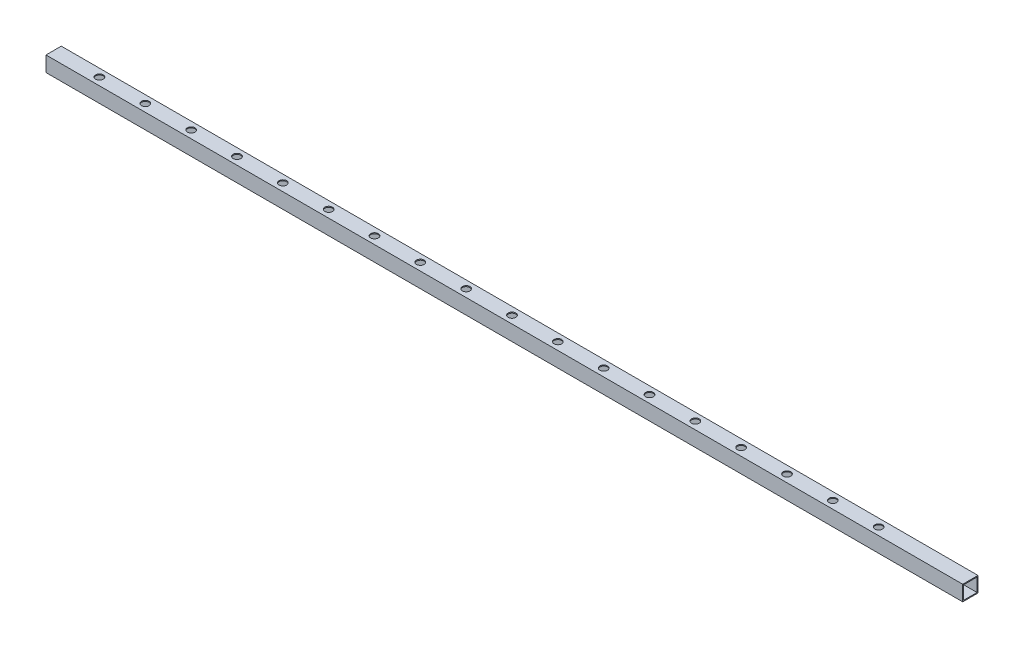
ISO-10303-21;
HEADER;
FILE_DESCRIPTION(('STEP AP214'),'2;1');
FILE_NAME('part.step','',(''),(''),'','','');
FILE_SCHEMA(('AUTOMOTIVE_DESIGN { 1 0 10303 214 1 1 1 1 }'));
ENDSEC;
DATA;
#1=APPLICATION_CONTEXT('core data for automotive mechanical design processes');
#2=APPLICATION_PROTOCOL_DEFINITION('international standard','automotive_design',2000,#1);
#3=PRODUCT_CONTEXT('',#1,'mechanical');
#4=PRODUCT('Part','Part','',(#3));
#5=PRODUCT_RELATED_PRODUCT_CATEGORY('part','',(#4));
#6=PRODUCT_DEFINITION_FORMATION('','',#4);
#7=PRODUCT_DEFINITION_CONTEXT('part definition',#1,'design');
#8=PRODUCT_DEFINITION('design','',#6,#7);
#9=PRODUCT_DEFINITION_SHAPE('','',#8);
#10=(LENGTH_UNIT() NAMED_UNIT(*) SI_UNIT(.MILLI.,.METRE.));
#11=(NAMED_UNIT(*) PLANE_ANGLE_UNIT() SI_UNIT($,.RADIAN.));
#12=(NAMED_UNIT(*) SI_UNIT($,.STERADIAN.) SOLID_ANGLE_UNIT());
#13=UNCERTAINTY_MEASURE_WITH_UNIT(LENGTH_MEASURE(1.E-05),#10,'distance_accuracy_value','');
#14=(GEOMETRIC_REPRESENTATION_CONTEXT(3) GLOBAL_UNCERTAINTY_ASSIGNED_CONTEXT((#13)) GLOBAL_UNIT_ASSIGNED_CONTEXT((#10,
#11,#12)) REPRESENTATION_CONTEXT('',''));
#15=CARTESIAN_POINT('',(0.,0.,0.));
#16=DIRECTION('',(0.,0.,1.));
#17=DIRECTION('',(1.,0.,0.));
#18=AXIS2_PLACEMENT_3D('',#15,#16,#17);
#19=CARTESIAN_POINT('',(76.2,12.7,0.));
#20=DIRECTION('',(0.,1.,0.));
#21=DIRECTION('',(0.,0.,1.));
#22=AXIS2_PLACEMENT_3D('',#19,#20,#21);
#23=CYLINDRICAL_SURFACE('',#22,6.35000000000008);
#24=CARTESIAN_POINT('',(76.2,12.7,0.));
#25=DIRECTION('',(0.,1.,0.));
#26=DIRECTION('',(0.,0.,1.));
#27=AXIS2_PLACEMENT_3D('',#24,#25,#26);
#28=CIRCLE('',#27,6.35000000000008);
#29=CARTESIAN_POINT('',(76.2,12.7,6.35000000000008));
#30=VERTEX_POINT('',#29);
#31=EDGE_CURVE('E46',#30,#30,#28,.T.);
#32=ORIENTED_EDGE('',*,*,#31,.T.);
#33=EDGE_LOOP('',(#32));
#34=FACE_BOUND('',#33,.T.);
#35=CARTESIAN_POINT('',(76.2,11.1125,0.));
#36=DIRECTION('',(0.,-1.,0.));
#37=DIRECTION('',(0.,0.,-1.));
#38=AXIS2_PLACEMENT_3D('',#35,#36,#37);
#39=CIRCLE('',#38,6.35000000000008);
#40=CARTESIAN_POINT('',(76.2,11.1125,-6.35000000000008));
#41=VERTEX_POINT('',#40);
#42=EDGE_CURVE('E11',#41,#41,#39,.T.);
#43=ORIENTED_EDGE('',*,*,#42,.T.);
#44=EDGE_LOOP('',(#43));
#45=FACE_BOUND('',#44,.T.);
#46=ADVANCED_FACE('F38',(#34,#45),#23,.F.);
#47=CARTESIAN_POINT('',(152.4,12.7,0.));
#48=DIRECTION('',(0.,1.,0.));
#49=DIRECTION('',(0.,0.,1.));
#50=AXIS2_PLACEMENT_3D('',#47,#48,#49);
#51=CYLINDRICAL_SURFACE('',#50,6.35000000000008);
#52=CARTESIAN_POINT('',(152.4,12.7,0.));
#53=DIRECTION('',(0.,1.,0.));
#54=DIRECTION('',(0.,0.,1.));
#55=AXIS2_PLACEMENT_3D('',#52,#53,#54);
#56=CIRCLE('',#55,6.35000000000008);
#57=CARTESIAN_POINT('',(152.4,12.7,6.35000000000008));
#58=VERTEX_POINT('',#57);
#59=EDGE_CURVE('E307',#58,#58,#56,.T.);
#60=ORIENTED_EDGE('',*,*,#59,.T.);
#61=EDGE_LOOP('',(#60));
#62=FACE_BOUND('',#61,.T.);
#63=CARTESIAN_POINT('',(152.4,11.1125,0.));
#64=DIRECTION('',(0.,-1.,0.));
#65=DIRECTION('',(0.,0.,-1.));
#66=AXIS2_PLACEMENT_3D('',#63,#64,#65);
#67=CIRCLE('',#66,6.35000000000008);
#68=CARTESIAN_POINT('',(152.4,11.1125,-6.35000000000008));
#69=VERTEX_POINT('',#68);
#70=EDGE_CURVE('E311',#69,#69,#67,.T.);
#71=ORIENTED_EDGE('',*,*,#70,.T.);
#72=EDGE_LOOP('',(#71));
#73=FACE_BOUND('',#72,.T.);
#74=ADVANCED_FACE('F342',(#62,#73),#51,.F.);
#75=CARTESIAN_POINT('',(228.6,12.7,0.));
#76=DIRECTION('',(0.,1.,0.));
#77=DIRECTION('',(0.,0.,1.));
#78=AXIS2_PLACEMENT_3D('',#75,#76,#77);
#79=CYLINDRICAL_SURFACE('',#78,6.35000000000008);
#80=CARTESIAN_POINT('',(228.6,12.7,0.));
#81=DIRECTION('',(0.,1.,0.));
#82=DIRECTION('',(0.,0.,1.));
#83=AXIS2_PLACEMENT_3D('',#80,#81,#82);
#84=CIRCLE('',#83,6.35000000000008);
#85=CARTESIAN_POINT('',(228.6,12.7,6.35000000000008));
#86=VERTEX_POINT('',#85);
#87=EDGE_CURVE('E299',#86,#86,#84,.T.);
#88=ORIENTED_EDGE('',*,*,#87,.T.);
#89=EDGE_LOOP('',(#88));
#90=FACE_BOUND('',#89,.T.);
#91=CARTESIAN_POINT('',(228.6,11.1125,0.));
#92=DIRECTION('',(0.,-1.,0.));
#93=DIRECTION('',(0.,0.,-1.));
#94=AXIS2_PLACEMENT_3D('',#91,#92,#93);
#95=CIRCLE('',#94,6.35000000000008);
#96=CARTESIAN_POINT('',(228.6,11.1125,-6.35000000000008));
#97=VERTEX_POINT('',#96);
#98=EDGE_CURVE('E303',#97,#97,#95,.T.);
#99=ORIENTED_EDGE('',*,*,#98,.T.);
#100=EDGE_LOOP('',(#99));
#101=FACE_BOUND('',#100,.T.);
#102=ADVANCED_FACE('F347',(#90,#101),#79,.F.);
#103=CARTESIAN_POINT('',(304.8,12.7,0.));
#104=DIRECTION('',(0.,1.,0.));
#105=DIRECTION('',(0.,0.,1.));
#106=AXIS2_PLACEMENT_3D('',#103,#104,#105);
#107=CYLINDRICAL_SURFACE('',#106,6.35000000000008);
#108=CARTESIAN_POINT('',(304.8,12.7,0.));
#109=DIRECTION('',(0.,1.,0.));
#110=DIRECTION('',(0.,0.,1.));
#111=AXIS2_PLACEMENT_3D('',#108,#109,#110);
#112=CIRCLE('',#111,6.35000000000008);
#113=CARTESIAN_POINT('',(304.8,12.7,6.35000000000008));
#114=VERTEX_POINT('',#113);
#115=EDGE_CURVE('E291',#114,#114,#112,.T.);
#116=ORIENTED_EDGE('',*,*,#115,.T.);
#117=EDGE_LOOP('',(#116));
#118=FACE_BOUND('',#117,.T.);
#119=CARTESIAN_POINT('',(304.8,11.1125,0.));
#120=DIRECTION('',(0.,-1.,0.));
#121=DIRECTION('',(0.,0.,-1.));
#122=AXIS2_PLACEMENT_3D('',#119,#120,#121);
#123=CIRCLE('',#122,6.35000000000008);
#124=CARTESIAN_POINT('',(304.8,11.1125,-6.35000000000008));
#125=VERTEX_POINT('',#124);
#126=EDGE_CURVE('E295',#125,#125,#123,.T.);
#127=ORIENTED_EDGE('',*,*,#126,.T.);
#128=EDGE_LOOP('',(#127));
#129=FACE_BOUND('',#128,.T.);
#130=ADVANCED_FACE('F352',(#118,#129),#107,.F.);
#131=CARTESIAN_POINT('',(381.,12.7,0.));
#132=DIRECTION('',(0.,1.,0.));
#133=DIRECTION('',(0.,0.,1.));
#134=AXIS2_PLACEMENT_3D('',#131,#132,#133);
#135=CYLINDRICAL_SURFACE('',#134,6.35000000000008);
#136=CARTESIAN_POINT('',(381.,12.7,0.));
#137=DIRECTION('',(0.,1.,0.));
#138=DIRECTION('',(0.,0.,1.));
#139=AXIS2_PLACEMENT_3D('',#136,#137,#138);
#140=CIRCLE('',#139,6.35000000000008);
#141=CARTESIAN_POINT('',(381.,12.7,6.35000000000008));
#142=VERTEX_POINT('',#141);
#143=EDGE_CURVE('E283',#142,#142,#140,.T.);
#144=ORIENTED_EDGE('',*,*,#143,.T.);
#145=EDGE_LOOP('',(#144));
#146=FACE_BOUND('',#145,.T.);
#147=CARTESIAN_POINT('',(381.,11.1125,0.));
#148=DIRECTION('',(0.,-1.,0.));
#149=DIRECTION('',(0.,0.,-1.));
#150=AXIS2_PLACEMENT_3D('',#147,#148,#149);
#151=CIRCLE('',#150,6.35000000000008);
#152=CARTESIAN_POINT('',(381.,11.1125,-6.35000000000008));
#153=VERTEX_POINT('',#152);
#154=EDGE_CURVE('E287',#153,#153,#151,.T.);
#155=ORIENTED_EDGE('',*,*,#154,.T.);
#156=EDGE_LOOP('',(#155));
#157=FACE_BOUND('',#156,.T.);
#158=ADVANCED_FACE('F359',(#146,#157),#135,.F.);
#159=CARTESIAN_POINT('',(457.2,12.7,0.));
#160=DIRECTION('',(0.,1.,0.));
#161=DIRECTION('',(0.,0.,1.));
#162=AXIS2_PLACEMENT_3D('',#159,#160,#161);
#163=CYLINDRICAL_SURFACE('',#162,6.35000000000008);
#164=CARTESIAN_POINT('',(457.2,12.7,0.));
#165=DIRECTION('',(0.,1.,0.));
#166=DIRECTION('',(0.,0.,1.));
#167=AXIS2_PLACEMENT_3D('',#164,#165,#166);
#168=CIRCLE('',#167,6.35000000000008);
#169=CARTESIAN_POINT('',(457.2,12.7,6.35000000000008));
#170=VERTEX_POINT('',#169);
#171=EDGE_CURVE('E275',#170,#170,#168,.T.);
#172=ORIENTED_EDGE('',*,*,#171,.T.);
#173=EDGE_LOOP('',(#172));
#174=FACE_BOUND('',#173,.T.);
#175=CARTESIAN_POINT('',(457.2,11.1125,0.));
#176=DIRECTION('',(0.,-1.,0.));
#177=DIRECTION('',(0.,0.,-1.));
#178=AXIS2_PLACEMENT_3D('',#175,#176,#177);
#179=CIRCLE('',#178,6.35000000000008);
#180=CARTESIAN_POINT('',(457.2,11.1125,-6.35000000000008));
#181=VERTEX_POINT('',#180);
#182=EDGE_CURVE('E279',#181,#181,#179,.T.);
#183=ORIENTED_EDGE('',*,*,#182,.T.);
#184=EDGE_LOOP('',(#183));
#185=FACE_BOUND('',#184,.T.);
#186=ADVANCED_FACE('F363',(#174,#185),#163,.F.);
#187=CARTESIAN_POINT('',(533.4,12.7,0.));
#188=DIRECTION('',(0.,1.,0.));
#189=DIRECTION('',(0.,0.,1.));
#190=AXIS2_PLACEMENT_3D('',#187,#188,#189);
#191=CYLINDRICAL_SURFACE('',#190,6.35000000000008);
#192=CARTESIAN_POINT('',(533.4,12.7,0.));
#193=DIRECTION('',(0.,1.,0.));
#194=DIRECTION('',(0.,0.,1.));
#195=AXIS2_PLACEMENT_3D('',#192,#193,#194);
#196=CIRCLE('',#195,6.35000000000008);
#197=CARTESIAN_POINT('',(533.4,12.7,6.35000000000008));
#198=VERTEX_POINT('',#197);
#199=EDGE_CURVE('E267',#198,#198,#196,.T.);
#200=ORIENTED_EDGE('',*,*,#199,.T.);
#201=EDGE_LOOP('',(#200));
#202=FACE_BOUND('',#201,.T.);
#203=CARTESIAN_POINT('',(533.4,11.1125,0.));
#204=DIRECTION('',(0.,-1.,0.));
#205=DIRECTION('',(0.,0.,-1.));
#206=AXIS2_PLACEMENT_3D('',#203,#204,#205);
#207=CIRCLE('',#206,6.35000000000008);
#208=CARTESIAN_POINT('',(533.4,11.1125,-6.35000000000008));
#209=VERTEX_POINT('',#208);
#210=EDGE_CURVE('E271',#209,#209,#207,.T.);
#211=ORIENTED_EDGE('',*,*,#210,.T.);
#212=EDGE_LOOP('',(#211));
#213=FACE_BOUND('',#212,.T.);
#214=ADVANCED_FACE('F367',(#202,#213),#191,.F.);
#215=CARTESIAN_POINT('',(609.6,12.7,0.));
#216=DIRECTION('',(0.,1.,0.));
#217=DIRECTION('',(0.,0.,1.));
#218=AXIS2_PLACEMENT_3D('',#215,#216,#217);
#219=CYLINDRICAL_SURFACE('',#218,6.35000000000008);
#220=CARTESIAN_POINT('',(609.6,12.7,0.));
#221=DIRECTION('',(0.,1.,0.));
#222=DIRECTION('',(0.,0.,1.));
#223=AXIS2_PLACEMENT_3D('',#220,#221,#222);
#224=CIRCLE('',#223,6.35000000000008);
#225=CARTESIAN_POINT('',(609.6,12.7,6.35000000000008));
#226=VERTEX_POINT('',#225);
#227=EDGE_CURVE('E259',#226,#226,#224,.T.);
#228=ORIENTED_EDGE('',*,*,#227,.T.);
#229=EDGE_LOOP('',(#228));
#230=FACE_BOUND('',#229,.T.);
#231=CARTESIAN_POINT('',(609.6,11.1125,0.));
#232=DIRECTION('',(0.,-1.,0.));
#233=DIRECTION('',(0.,0.,-1.));
#234=AXIS2_PLACEMENT_3D('',#231,#232,#233);
#235=CIRCLE('',#234,6.35000000000008);
#236=CARTESIAN_POINT('',(609.6,11.1125,-6.35000000000008));
#237=VERTEX_POINT('',#236);
#238=EDGE_CURVE('E263',#237,#237,#235,.T.);
#239=ORIENTED_EDGE('',*,*,#238,.T.);
#240=EDGE_LOOP('',(#239));
#241=FACE_BOUND('',#240,.T.);
#242=ADVANCED_FACE('F371',(#230,#241),#219,.F.);
#243=CARTESIAN_POINT('',(685.8,12.7,0.));
#244=DIRECTION('',(0.,1.,0.));
#245=DIRECTION('',(0.,0.,1.));
#246=AXIS2_PLACEMENT_3D('',#243,#244,#245);
#247=CYLINDRICAL_SURFACE('',#246,6.35000000000008);
#248=CARTESIAN_POINT('',(685.8,12.7,0.));
#249=DIRECTION('',(0.,1.,0.));
#250=DIRECTION('',(0.,0.,1.));
#251=AXIS2_PLACEMENT_3D('',#248,#249,#250);
#252=CIRCLE('',#251,6.35000000000008);
#253=CARTESIAN_POINT('',(685.8,12.7,6.35000000000008));
#254=VERTEX_POINT('',#253);
#255=EDGE_CURVE('E251',#254,#254,#252,.T.);
#256=ORIENTED_EDGE('',*,*,#255,.T.);
#257=EDGE_LOOP('',(#256));
#258=FACE_BOUND('',#257,.T.);
#259=CARTESIAN_POINT('',(685.8,11.1125,0.));
#260=DIRECTION('',(0.,-1.,0.));
#261=DIRECTION('',(0.,0.,-1.));
#262=AXIS2_PLACEMENT_3D('',#259,#260,#261);
#263=CIRCLE('',#262,6.35000000000008);
#264=CARTESIAN_POINT('',(685.8,11.1125,-6.35000000000008));
#265=VERTEX_POINT('',#264);
#266=EDGE_CURVE('E255',#265,#265,#263,.T.);
#267=ORIENTED_EDGE('',*,*,#266,.T.);
#268=EDGE_LOOP('',(#267));
#269=FACE_BOUND('',#268,.T.);
#270=ADVANCED_FACE('F375',(#258,#269),#247,.F.);
#271=CARTESIAN_POINT('',(762.,12.7,0.));
#272=DIRECTION('',(0.,1.,0.));
#273=DIRECTION('',(0.,0.,1.));
#274=AXIS2_PLACEMENT_3D('',#271,#272,#273);
#275=CYLINDRICAL_SURFACE('',#274,6.35000000000008);
#276=CARTESIAN_POINT('',(762.,12.7,0.));
#277=DIRECTION('',(0.,1.,0.));
#278=DIRECTION('',(0.,0.,1.));
#279=AXIS2_PLACEMENT_3D('',#276,#277,#278);
#280=CIRCLE('',#279,6.35000000000008);
#281=CARTESIAN_POINT('',(762.,12.7,6.35000000000008));
#282=VERTEX_POINT('',#281);
#283=EDGE_CURVE('E243',#282,#282,#280,.T.);
#284=ORIENTED_EDGE('',*,*,#283,.T.);
#285=EDGE_LOOP('',(#284));
#286=FACE_BOUND('',#285,.T.);
#287=CARTESIAN_POINT('',(762.,11.1125,0.));
#288=DIRECTION('',(0.,-1.,0.));
#289=DIRECTION('',(0.,0.,-1.));
#290=AXIS2_PLACEMENT_3D('',#287,#288,#289);
#291=CIRCLE('',#290,6.35000000000008);
#292=CARTESIAN_POINT('',(762.,11.1125,-6.35000000000008));
#293=VERTEX_POINT('',#292);
#294=EDGE_CURVE('E247',#293,#293,#291,.T.);
#295=ORIENTED_EDGE('',*,*,#294,.T.);
#296=EDGE_LOOP('',(#295));
#297=FACE_BOUND('',#296,.T.);
#298=ADVANCED_FACE('F379',(#286,#297),#275,.F.);
#299=CARTESIAN_POINT('',(838.2,12.7,0.));
#300=DIRECTION('',(0.,1.,0.));
#301=DIRECTION('',(0.,0.,1.));
#302=AXIS2_PLACEMENT_3D('',#299,#300,#301);
#303=CYLINDRICAL_SURFACE('',#302,6.35000000000008);
#304=CARTESIAN_POINT('',(838.2,12.7,0.));
#305=DIRECTION('',(0.,1.,0.));
#306=DIRECTION('',(0.,0.,1.));
#307=AXIS2_PLACEMENT_3D('',#304,#305,#306);
#308=CIRCLE('',#307,6.35000000000008);
#309=CARTESIAN_POINT('',(838.2,12.7,6.35000000000008));
#310=VERTEX_POINT('',#309);
#311=EDGE_CURVE('E235',#310,#310,#308,.T.);
#312=ORIENTED_EDGE('',*,*,#311,.T.);
#313=EDGE_LOOP('',(#312));
#314=FACE_BOUND('',#313,.T.);
#315=CARTESIAN_POINT('',(838.2,11.1125,0.));
#316=DIRECTION('',(0.,-1.,0.));
#317=DIRECTION('',(0.,0.,-1.));
#318=AXIS2_PLACEMENT_3D('',#315,#316,#317);
#319=CIRCLE('',#318,6.35000000000008);
#320=CARTESIAN_POINT('',(838.2,11.1125,-6.35000000000008));
#321=VERTEX_POINT('',#320);
#322=EDGE_CURVE('E239',#321,#321,#319,.T.);
#323=ORIENTED_EDGE('',*,*,#322,.T.);
#324=EDGE_LOOP('',(#323));
#325=FACE_BOUND('',#324,.T.);
#326=ADVANCED_FACE('F383',(#314,#325),#303,.F.);
#327=CARTESIAN_POINT('',(914.4,12.7,0.));
#328=DIRECTION('',(0.,1.,0.));
#329=DIRECTION('',(0.,0.,1.));
#330=AXIS2_PLACEMENT_3D('',#327,#328,#329);
#331=CYLINDRICAL_SURFACE('',#330,6.35000000000008);
#332=CARTESIAN_POINT('',(914.4,12.7,0.));
#333=DIRECTION('',(0.,1.,0.));
#334=DIRECTION('',(0.,0.,1.));
#335=AXIS2_PLACEMENT_3D('',#332,#333,#334);
#336=CIRCLE('',#335,6.35000000000008);
#337=CARTESIAN_POINT('',(914.4,12.7,6.35000000000008));
#338=VERTEX_POINT('',#337);
#339=EDGE_CURVE('E227',#338,#338,#336,.T.);
#340=ORIENTED_EDGE('',*,*,#339,.T.);
#341=EDGE_LOOP('',(#340));
#342=FACE_BOUND('',#341,.T.);
#343=CARTESIAN_POINT('',(914.4,11.1125,0.));
#344=DIRECTION('',(0.,-1.,0.));
#345=DIRECTION('',(0.,0.,-1.));
#346=AXIS2_PLACEMENT_3D('',#343,#344,#345);
#347=CIRCLE('',#346,6.35000000000008);
#348=CARTESIAN_POINT('',(914.4,11.1125,-6.35000000000008));
#349=VERTEX_POINT('',#348);
#350=EDGE_CURVE('E231',#349,#349,#347,.T.);
#351=ORIENTED_EDGE('',*,*,#350,.T.);
#352=EDGE_LOOP('',(#351));
#353=FACE_BOUND('',#352,.T.);
#354=ADVANCED_FACE('F387',(#342,#353),#331,.F.);
#355=CARTESIAN_POINT('',(990.6,12.7,0.));
#356=DIRECTION('',(0.,1.,0.));
#357=DIRECTION('',(0.,0.,1.));
#358=AXIS2_PLACEMENT_3D('',#355,#356,#357);
#359=CYLINDRICAL_SURFACE('',#358,6.35000000000008);
#360=CARTESIAN_POINT('',(990.6,12.7,0.));
#361=DIRECTION('',(0.,1.,0.));
#362=DIRECTION('',(0.,0.,1.));
#363=AXIS2_PLACEMENT_3D('',#360,#361,#362);
#364=CIRCLE('',#363,6.35000000000008);
#365=CARTESIAN_POINT('',(990.6,12.7,6.35000000000008));
#366=VERTEX_POINT('',#365);
#367=EDGE_CURVE('E219',#366,#366,#364,.T.);
#368=ORIENTED_EDGE('',*,*,#367,.T.);
#369=EDGE_LOOP('',(#368));
#370=FACE_BOUND('',#369,.T.);
#371=CARTESIAN_POINT('',(990.6,11.1125,0.));
#372=DIRECTION('',(0.,-1.,0.));
#373=DIRECTION('',(0.,0.,-1.));
#374=AXIS2_PLACEMENT_3D('',#371,#372,#373);
#375=CIRCLE('',#374,6.35000000000008);
#376=CARTESIAN_POINT('',(990.6,11.1125,-6.35000000000008));
#377=VERTEX_POINT('',#376);
#378=EDGE_CURVE('E223',#377,#377,#375,.T.);
#379=ORIENTED_EDGE('',*,*,#378,.T.);
#380=EDGE_LOOP('',(#379));
#381=FACE_BOUND('',#380,.T.);
#382=ADVANCED_FACE('F391',(#370,#381),#359,.F.);
#383=CARTESIAN_POINT('',(1066.8,12.7,0.));
#384=DIRECTION('',(0.,1.,0.));
#385=DIRECTION('',(0.,0.,1.));
#386=AXIS2_PLACEMENT_3D('',#383,#384,#385);
#387=CYLINDRICAL_SURFACE('',#386,6.35000000000008);
#388=CARTESIAN_POINT('',(1066.8,12.7,0.));
#389=DIRECTION('',(0.,1.,0.));
#390=DIRECTION('',(0.,0.,1.));
#391=AXIS2_PLACEMENT_3D('',#388,#389,#390);
#392=CIRCLE('',#391,6.35000000000008);
#393=CARTESIAN_POINT('',(1066.8,12.7,6.35000000000008));
#394=VERTEX_POINT('',#393);
#395=EDGE_CURVE('E211',#394,#394,#392,.T.);
#396=ORIENTED_EDGE('',*,*,#395,.T.);
#397=EDGE_LOOP('',(#396));
#398=FACE_BOUND('',#397,.T.);
#399=CARTESIAN_POINT('',(1066.8,11.1125,0.));
#400=DIRECTION('',(0.,-1.,0.));
#401=DIRECTION('',(0.,0.,-1.));
#402=AXIS2_PLACEMENT_3D('',#399,#400,#401);
#403=CIRCLE('',#402,6.35000000000008);
#404=CARTESIAN_POINT('',(1066.8,11.1125,-6.35000000000008));
#405=VERTEX_POINT('',#404);
#406=EDGE_CURVE('E215',#405,#405,#403,.T.);
#407=ORIENTED_EDGE('',*,*,#406,.T.);
#408=EDGE_LOOP('',(#407));
#409=FACE_BOUND('',#408,.T.);
#410=ADVANCED_FACE('F395',(#398,#409),#387,.F.);
#411=CARTESIAN_POINT('',(1143.,12.7,0.));
#412=DIRECTION('',(0.,1.,0.));
#413=DIRECTION('',(0.,0.,1.));
#414=AXIS2_PLACEMENT_3D('',#411,#412,#413);
#415=CYLINDRICAL_SURFACE('',#414,6.35000000000008);
#416=CARTESIAN_POINT('',(1143.,12.7,0.));
#417=DIRECTION('',(0.,1.,0.));
#418=DIRECTION('',(0.,0.,1.));
#419=AXIS2_PLACEMENT_3D('',#416,#417,#418);
#420=CIRCLE('',#419,6.35000000000008);
#421=CARTESIAN_POINT('',(1143.,12.7,6.35000000000008));
#422=VERTEX_POINT('',#421);
#423=EDGE_CURVE('E203',#422,#422,#420,.T.);
#424=ORIENTED_EDGE('',*,*,#423,.T.);
#425=EDGE_LOOP('',(#424));
#426=FACE_BOUND('',#425,.T.);
#427=CARTESIAN_POINT('',(1143.,11.1125,0.));
#428=DIRECTION('',(0.,-1.,0.));
#429=DIRECTION('',(0.,0.,-1.));
#430=AXIS2_PLACEMENT_3D('',#427,#428,#429);
#431=CIRCLE('',#430,6.35000000000008);
#432=CARTESIAN_POINT('',(1143.,11.1125,-6.35000000000008));
#433=VERTEX_POINT('',#432);
#434=EDGE_CURVE('E207',#433,#433,#431,.T.);
#435=ORIENTED_EDGE('',*,*,#434,.T.);
#436=EDGE_LOOP('',(#435));
#437=FACE_BOUND('',#436,.T.);
#438=ADVANCED_FACE('F334',(#426,#437),#415,.F.);
#439=CARTESIAN_POINT('',(1219.2,12.7,0.));
#440=DIRECTION('',(0.,1.,0.));
#441=DIRECTION('',(0.,0.,1.));
#442=AXIS2_PLACEMENT_3D('',#439,#440,#441);
#443=CYLINDRICAL_SURFACE('',#442,6.35000000000008);
#444=CARTESIAN_POINT('',(1219.2,12.7,0.));
#445=DIRECTION('',(0.,1.,0.));
#446=DIRECTION('',(0.,0.,1.));
#447=AXIS2_PLACEMENT_3D('',#444,#445,#446);
#448=CIRCLE('',#447,6.35000000000008);
#449=CARTESIAN_POINT('',(1219.2,12.7,6.35000000000008));
#450=VERTEX_POINT('',#449);
#451=EDGE_CURVE('E195',#450,#450,#448,.T.);
#452=ORIENTED_EDGE('',*,*,#451,.T.);
#453=EDGE_LOOP('',(#452));
#454=FACE_BOUND('',#453,.T.);
#455=CARTESIAN_POINT('',(1219.2,11.1125,0.));
#456=DIRECTION('',(0.,-1.,0.));
#457=DIRECTION('',(0.,0.,-1.));
#458=AXIS2_PLACEMENT_3D('',#455,#456,#457);
#459=CIRCLE('',#458,6.35000000000008);
#460=CARTESIAN_POINT('',(1219.2,11.1125,-6.35000000000008));
#461=VERTEX_POINT('',#460);
#462=EDGE_CURVE('E199',#461,#461,#459,.T.);
#463=ORIENTED_EDGE('',*,*,#462,.T.);
#464=EDGE_LOOP('',(#463));
#465=FACE_BOUND('',#464,.T.);
#466=ADVANCED_FACE('F322',(#454,#465),#443,.F.);
#467=CARTESIAN_POINT('',(1524.,12.7,12.7));
#468=DIRECTION('',(0.,-1.,0.));
#469=DIRECTION('',(0.,0.,-1.));
#470=AXIS2_PLACEMENT_3D('',#467,#468,#469);
#471=PLANE('',#470);
#472=CARTESIAN_POINT('',(1295.4,12.7,0.));
#473=DIRECTION('',(0.,1.,0.));
#474=DIRECTION('',(0.,0.,1.));
#475=AXIS2_PLACEMENT_3D('',#472,#473,#474);
#476=CIRCLE('',#475,6.35000000000008);
#477=CARTESIAN_POINT('',(1295.4,12.7,6.35000000000008));
#478=VERTEX_POINT('',#477);
#479=EDGE_CURVE('E453',#478,#478,#476,.T.);
#480=ORIENTED_EDGE('',*,*,#479,.F.);
#481=EDGE_LOOP('',(#480));
#482=FACE_BOUND('',#481,.T.);
#483=DIRECTION('',(0.,0.,1.));
#484=VECTOR('',#483,1.);
#485=CARTESIAN_POINT('',(0.,12.7,12.7));
#486=LINE('',#485,#484);
#487=CARTESIAN_POINT('',(0.,12.7,-12.7));
#488=VERTEX_POINT('',#487);
#489=CARTESIAN_POINT('',(0.,12.7,12.7));
#490=VERTEX_POINT('',#489);
#491=EDGE_CURVE('E172',#488,#490,#486,.T.);
#492=ORIENTED_EDGE('',*,*,#491,.T.);
#493=DIRECTION('',(-1.,0.,0.));
#494=VECTOR('',#493,1.);
#495=CARTESIAN_POINT('',(1524.,12.7,12.7));
#496=LINE('',#495,#494);
#497=CARTESIAN_POINT('',(1524.,12.7,12.7));
#498=VERTEX_POINT('',#497);
#499=EDGE_CURVE('E187',#498,#490,#496,.T.);
#500=ORIENTED_EDGE('',*,*,#499,.F.);
#501=DIRECTION('',(0.,0.,1.));
#502=VECTOR('',#501,1.);
#503=CARTESIAN_POINT('',(1524.,12.7,12.7));
#504=LINE('',#503,#502);
#505=CARTESIAN_POINT('',(1524.,12.7,-12.7));
#506=VERTEX_POINT('',#505);
#507=EDGE_CURVE('E158',#506,#498,#504,.T.);
#508=ORIENTED_EDGE('',*,*,#507,.F.);
#509=DIRECTION('',(-1.,0.,0.));
#510=VECTOR('',#509,1.);
#511=CARTESIAN_POINT('',(1524.,12.7,-12.7));
#512=LINE('',#511,#510);
#513=EDGE_CURVE('E191',#506,#488,#512,.T.);
#514=ORIENTED_EDGE('',*,*,#513,.T.);
#515=EDGE_LOOP('',(#492,#500,#508,#514));
#516=FACE_BOUND('',#515,.T.);
#517=CARTESIAN_POINT('',(1371.6,12.7,0.));
#518=DIRECTION('',(0.,1.,0.));
#519=DIRECTION('',(0.,0.,1.));
#520=AXIS2_PLACEMENT_3D('',#517,#518,#519);
#521=CIRCLE('',#520,6.35000000000008);
#522=CARTESIAN_POINT('',(1371.6,12.7,6.35000000000008));
#523=VERTEX_POINT('',#522);
#524=EDGE_CURVE('E458',#523,#523,#521,.T.);
#525=ORIENTED_EDGE('',*,*,#524,.F.);
#526=EDGE_LOOP('',(#525));
#527=FACE_BOUND('',#526,.T.);
#528=ORIENTED_EDGE('',*,*,#451,.F.);
#529=EDGE_LOOP('',(#528));
#530=FACE_BOUND('',#529,.T.);
#531=ORIENTED_EDGE('',*,*,#423,.F.);
#532=EDGE_LOOP('',(#531));
#533=FACE_BOUND('',#532,.T.);
#534=ORIENTED_EDGE('',*,*,#395,.F.);
#535=EDGE_LOOP('',(#534));
#536=FACE_BOUND('',#535,.T.);
#537=ORIENTED_EDGE('',*,*,#367,.F.);
#538=EDGE_LOOP('',(#537));
#539=FACE_BOUND('',#538,.T.);
#540=ORIENTED_EDGE('',*,*,#339,.F.);
#541=EDGE_LOOP('',(#540));
#542=FACE_BOUND('',#541,.T.);
#543=ORIENTED_EDGE('',*,*,#311,.F.);
#544=EDGE_LOOP('',(#543));
#545=FACE_BOUND('',#544,.T.);
#546=ORIENTED_EDGE('',*,*,#283,.F.);
#547=EDGE_LOOP('',(#546));
#548=FACE_BOUND('',#547,.T.);
#549=ORIENTED_EDGE('',*,*,#255,.F.);
#550=EDGE_LOOP('',(#549));
#551=FACE_BOUND('',#550,.T.);
#552=ORIENTED_EDGE('',*,*,#227,.F.);
#553=EDGE_LOOP('',(#552));
#554=FACE_BOUND('',#553,.T.);
#555=ORIENTED_EDGE('',*,*,#199,.F.);
#556=EDGE_LOOP('',(#555));
#557=FACE_BOUND('',#556,.T.);
#558=ORIENTED_EDGE('',*,*,#171,.F.);
#559=EDGE_LOOP('',(#558));
#560=FACE_BOUND('',#559,.T.);
#561=ORIENTED_EDGE('',*,*,#143,.F.);
#562=EDGE_LOOP('',(#561));
#563=FACE_BOUND('',#562,.T.);
#564=ORIENTED_EDGE('',*,*,#115,.F.);
#565=EDGE_LOOP('',(#564));
#566=FACE_BOUND('',#565,.T.);
#567=ORIENTED_EDGE('',*,*,#87,.F.);
#568=EDGE_LOOP('',(#567));
#569=FACE_BOUND('',#568,.T.);
#570=ORIENTED_EDGE('',*,*,#59,.F.);
#571=EDGE_LOOP('',(#570));
#572=FACE_BOUND('',#571,.T.);
#573=ORIENTED_EDGE('',*,*,#31,.F.);
#574=EDGE_LOOP('',(#573));
#575=FACE_BOUND('',#574,.T.);
#576=ADVANCED_FACE('F320',(#482,#516,#527,#530,#533,#536,#539,#542,#545,#548,#551,#554,#557,
#560,#563,#566,#569,#572,#575),#471,.F.);
#577=CARTESIAN_POINT('',(1524.,0.,0.));
#578=DIRECTION('',(-1.,0.,0.));
#579=DIRECTION('',(0.,0.,1.));
#580=AXIS2_PLACEMENT_3D('',#577,#578,#579);
#581=PLANE('',#580);
#582=DIRECTION('',(0.,1.,0.));
#583=VECTOR('',#582,1.);
#584=CARTESIAN_POINT('',(1524.,-12.7,-12.7));
#585=LINE('',#584,#583);
#586=CARTESIAN_POINT('',(1524.,-12.7,-12.7));
#587=VERTEX_POINT('',#586);
#588=EDGE_CURVE('E154',#587,#506,#585,.T.);
#589=ORIENTED_EDGE('',*,*,#588,.T.);
#590=ORIENTED_EDGE('',*,*,#507,.T.);
#591=DIRECTION('',(0.,-1.,0.));
#592=VECTOR('',#591,1.);
#593=CARTESIAN_POINT('',(1524.,-12.7,12.7));
#594=LINE('',#593,#592);
#595=CARTESIAN_POINT('',(1524.,-12.7,12.7));
#596=VERTEX_POINT('',#595);
#597=EDGE_CURVE('E162',#498,#596,#594,.T.);
#598=ORIENTED_EDGE('',*,*,#597,.T.);
#599=DIRECTION('',(0.,0.,-1.));
#600=VECTOR('',#599,1.);
#601=CARTESIAN_POINT('',(1524.,-12.7,12.7));
#602=LINE('',#601,#600);
#603=EDGE_CURVE('E165',#596,#587,#602,.T.);
#604=ORIENTED_EDGE('',*,*,#603,.T.);
#605=EDGE_LOOP('',(#589,#590,#598,#604));
#606=FACE_BOUND('',#605,.T.);
#607=DIRECTION('',(0.,0.,-1.));
#608=VECTOR('',#607,1.);
#609=CARTESIAN_POINT('',(1524.,-11.1125,11.1125));
#610=LINE('',#609,#608);
#611=CARTESIAN_POINT('',(1524.,-11.1125,11.1125));
#612=VERTEX_POINT('',#611);
#613=CARTESIAN_POINT('',(1524.,-11.1125,-11.1125));
#614=VERTEX_POINT('',#613);
#615=EDGE_CURVE('E103',#612,#614,#610,.T.);
#616=ORIENTED_EDGE('',*,*,#615,.F.);
#617=DIRECTION('',(0.,-1.,0.));
#618=VECTOR('',#617,1.);
#619=CARTESIAN_POINT('',(1524.,-11.1125,11.1125));
#620=LINE('',#619,#618);
#621=CARTESIAN_POINT('',(1524.,11.1125,11.1125));
#622=VERTEX_POINT('',#621);
#623=EDGE_CURVE('E130',#622,#612,#620,.T.);
#624=ORIENTED_EDGE('',*,*,#623,.F.);
#625=DIRECTION('',(0.,0.,1.));
#626=VECTOR('',#625,1.);
#627=CARTESIAN_POINT('',(1524.,11.1125,11.1125));
#628=LINE('',#627,#626);
#629=CARTESIAN_POINT('',(1524.,11.1125,-11.1125));
#630=VERTEX_POINT('',#629);
#631=EDGE_CURVE('E126',#630,#622,#628,.T.);
#632=ORIENTED_EDGE('',*,*,#631,.F.);
#633=DIRECTION('',(0.,1.,0.));
#634=VECTOR('',#633,1.);
#635=CARTESIAN_POINT('',(1524.,-11.1125,-11.1125));
#636=LINE('',#635,#634);
#637=EDGE_CURVE('E112',#614,#630,#636,.T.);
#638=ORIENTED_EDGE('',*,*,#637,.F.);
#639=EDGE_LOOP('',(#616,#624,#632,#638));
#640=FACE_BOUND('',#639,.T.);
#641=ADVANCED_FACE('F125',(#606,#640),#581,.F.);
#642=CARTESIAN_POINT('',(0.,0.,0.));
#643=DIRECTION('',(-1.,0.,0.));
#644=DIRECTION('',(0.,0.,1.));
#645=AXIS2_PLACEMENT_3D('',#642,#643,#644);
#646=PLANE('',#645);
#647=DIRECTION('',(0.,1.,0.));
#648=VECTOR('',#647,1.);
#649=CARTESIAN_POINT('',(0.,-12.7,-12.7));
#650=LINE('',#649,#648);
#651=CARTESIAN_POINT('',(0.,-12.7,-12.7));
#652=VERTEX_POINT('',#651);
#653=EDGE_CURVE('E121',#652,#488,#650,.T.);
#654=ORIENTED_EDGE('',*,*,#653,.F.);
#655=DIRECTION('',(0.,0.,-1.));
#656=VECTOR('',#655,1.);
#657=CARTESIAN_POINT('',(0.,-12.7,12.7));
#658=LINE('',#657,#656);
#659=CARTESIAN_POINT('',(0.,-12.7,12.7));
#660=VERTEX_POINT('',#659);
#661=EDGE_CURVE('E159',#660,#652,#658,.T.);
#662=ORIENTED_EDGE('',*,*,#661,.F.);
#663=DIRECTION('',(0.,-1.,0.));
#664=VECTOR('',#663,1.);
#665=CARTESIAN_POINT('',(0.,-12.7,12.7));
#666=LINE('',#665,#664);
#667=EDGE_CURVE('E175',#490,#660,#666,.T.);
#668=ORIENTED_EDGE('',*,*,#667,.F.);
#669=ORIENTED_EDGE('',*,*,#491,.F.);
#670=EDGE_LOOP('',(#654,#662,#668,#669));
#671=FACE_BOUND('',#670,.T.);
#672=DIRECTION('',(0.,-1.,0.));
#673=VECTOR('',#672,1.);
#674=CARTESIAN_POINT('',(0.,-11.1125,11.1125));
#675=LINE('',#674,#673);
#676=CARTESIAN_POINT('',(0.,11.1125,11.1125));
#677=VERTEX_POINT('',#676);
#678=CARTESIAN_POINT('',(0.,-11.1125,11.1125));
#679=VERTEX_POINT('',#678);
#680=EDGE_CURVE('E113',#677,#679,#675,.T.);
#681=ORIENTED_EDGE('',*,*,#680,.T.);
#682=DIRECTION('',(0.,0.,-1.));
#683=VECTOR('',#682,1.);
#684=CARTESIAN_POINT('',(0.,-11.1125,11.1125));
#685=LINE('',#684,#683);
#686=CARTESIAN_POINT('',(0.,-11.1125,-11.1125));
#687=VERTEX_POINT('',#686);
#688=EDGE_CURVE('E61',#679,#687,#685,.T.);
#689=ORIENTED_EDGE('',*,*,#688,.T.);
#690=DIRECTION('',(0.,1.,0.));
#691=VECTOR('',#690,1.);
#692=CARTESIAN_POINT('',(0.,-11.1125,-11.1125));
#693=LINE('',#692,#691);
#694=CARTESIAN_POINT('',(0.,11.1125,-11.1125));
#695=VERTEX_POINT('',#694);
#696=EDGE_CURVE('E119',#687,#695,#693,.T.);
#697=ORIENTED_EDGE('',*,*,#696,.T.);
#698=DIRECTION('',(0.,0.,1.));
#699=VECTOR('',#698,1.);
#700=CARTESIAN_POINT('',(0.,11.1125,11.1125));
#701=LINE('',#700,#699);
#702=EDGE_CURVE('E141',#695,#677,#701,.T.);
#703=ORIENTED_EDGE('',*,*,#702,.T.);
#704=EDGE_LOOP('',(#681,#689,#697,#703));
#705=FACE_BOUND('',#704,.T.);
#706=ADVANCED_FACE('F330',(#671,#705),#646,.T.);
#707=CARTESIAN_POINT('',(1524.,-12.7,-12.7));
#708=DIRECTION('',(0.,0.,1.));
#709=DIRECTION('',(1.,0.,0.));
#710=AXIS2_PLACEMENT_3D('',#707,#708,#709);
#711=PLANE('',#710);
#712=ORIENTED_EDGE('',*,*,#653,.T.);
#713=ORIENTED_EDGE('',*,*,#513,.F.);
#714=ORIENTED_EDGE('',*,*,#588,.F.);
#715=DIRECTION('',(-1.,0.,0.));
#716=VECTOR('',#715,1.);
#717=CARTESIAN_POINT('',(1524.,-12.7,-12.7));
#718=LINE('',#717,#716);
#719=EDGE_CURVE('E168',#587,#652,#718,.T.);
#720=ORIENTED_EDGE('',*,*,#719,.T.);
#721=EDGE_LOOP('',(#712,#713,#714,#720));
#722=FACE_BOUND('',#721,.T.);
#723=ADVANCED_FACE('F402',(#722),#711,.F.);
#724=CARTESIAN_POINT('',(1524.,-12.7,12.7));
#725=DIRECTION('',(0.,0.,-1.));
#726=DIRECTION('',(-1.,0.,0.));
#727=AXIS2_PLACEMENT_3D('',#724,#725,#726);
#728=PLANE('',#727);
#729=ORIENTED_EDGE('',*,*,#667,.T.);
#730=DIRECTION('',(-1.,0.,0.));
#731=VECTOR('',#730,1.);
#732=CARTESIAN_POINT('',(1524.,-12.7,12.7));
#733=LINE('',#732,#731);
#734=EDGE_CURVE('E183',#596,#660,#733,.T.);
#735=ORIENTED_EDGE('',*,*,#734,.F.);
#736=ORIENTED_EDGE('',*,*,#597,.F.);
#737=ORIENTED_EDGE('',*,*,#499,.T.);
#738=EDGE_LOOP('',(#729,#735,#736,#737));
#739=FACE_BOUND('',#738,.T.);
#740=ADVANCED_FACE('F404',(#739),#728,.F.);
#741=CARTESIAN_POINT('',(1524.,-12.7,12.7));
#742=DIRECTION('',(0.,1.,0.));
#743=DIRECTION('',(0.,0.,1.));
#744=AXIS2_PLACEMENT_3D('',#741,#742,#743);
#745=PLANE('',#744);
#746=ORIENTED_EDGE('',*,*,#661,.T.);
#747=ORIENTED_EDGE('',*,*,#719,.F.);
#748=ORIENTED_EDGE('',*,*,#603,.F.);
#749=ORIENTED_EDGE('',*,*,#734,.T.);
#750=EDGE_LOOP('',(#746,#747,#748,#749));
#751=FACE_BOUND('',#750,.T.);
#752=ADVANCED_FACE('F410',(#751),#745,.F.);
#753=CARTESIAN_POINT('',(1524.,-11.1125,11.1125));
#754=DIRECTION('',(0.,1.,0.));
#755=DIRECTION('',(0.,0.,1.));
#756=AXIS2_PLACEMENT_3D('',#753,#754,#755);
#757=PLANE('',#756);
#758=ORIENTED_EDGE('',*,*,#688,.F.);
#759=DIRECTION('',(-1.,0.,0.));
#760=VECTOR('',#759,1.);
#761=CARTESIAN_POINT('',(1524.,-11.1125,11.1125));
#762=LINE('',#761,#760);
#763=EDGE_CURVE('E107',#612,#679,#762,.T.);
#764=ORIENTED_EDGE('',*,*,#763,.F.);
#765=ORIENTED_EDGE('',*,*,#615,.T.);
#766=DIRECTION('',(-1.,0.,0.));
#767=VECTOR('',#766,1.);
#768=CARTESIAN_POINT('',(1524.,-11.1125,-11.1125));
#769=LINE('',#768,#767);
#770=EDGE_CURVE('E106',#614,#687,#769,.T.);
#771=ORIENTED_EDGE('',*,*,#770,.T.);
#772=EDGE_LOOP('',(#758,#764,#765,#771));
#773=FACE_BOUND('',#772,.T.);
#774=ADVANCED_FACE('F105',(#773),#757,.T.);
#775=CARTESIAN_POINT('',(1524.,-11.1125,-11.1125));
#776=DIRECTION('',(0.,0.,1.));
#777=DIRECTION('',(0.,-1.,0.));
#778=AXIS2_PLACEMENT_3D('',#775,#776,#777);
#779=PLANE('',#778);
#780=ORIENTED_EDGE('',*,*,#696,.F.);
#781=ORIENTED_EDGE('',*,*,#770,.F.);
#782=ORIENTED_EDGE('',*,*,#637,.T.);
#783=DIRECTION('',(-1.,0.,0.));
#784=VECTOR('',#783,1.);
#785=CARTESIAN_POINT('',(1524.,11.1125,-11.1125));
#786=LINE('',#785,#784);
#787=EDGE_CURVE('E122',#630,#695,#786,.T.);
#788=ORIENTED_EDGE('',*,*,#787,.T.);
#789=EDGE_LOOP('',(#780,#781,#782,#788));
#790=FACE_BOUND('',#789,.T.);
#791=ADVANCED_FACE('F116',(#790),#779,.T.);
#792=CARTESIAN_POINT('',(1524.,11.1125,11.1125));
#793=DIRECTION('',(0.,-1.,0.));
#794=DIRECTION('',(0.,0.,-1.));
#795=AXIS2_PLACEMENT_3D('',#792,#793,#794);
#796=PLANE('',#795);
#797=CARTESIAN_POINT('',(1295.4,11.1125,0.));
#798=DIRECTION('',(0.,-1.,0.));
#799=DIRECTION('',(0.,0.,-1.));
#800=AXIS2_PLACEMENT_3D('',#797,#798,#799);
#801=CIRCLE('',#800,6.35000000000008);
#802=CARTESIAN_POINT('',(1295.4,11.1125,-6.35000000000008));
#803=VERTEX_POINT('',#802);
#804=EDGE_CURVE('E456',#803,#803,#801,.T.);
#805=ORIENTED_EDGE('',*,*,#804,.F.);
#806=EDGE_LOOP('',(#805));
#807=FACE_BOUND('',#806,.T.);
#808=CARTESIAN_POINT('',(1371.6,11.1125,0.));
#809=DIRECTION('',(0.,-1.,0.));
#810=DIRECTION('',(0.,0.,-1.));
#811=AXIS2_PLACEMENT_3D('',#808,#809,#810);
#812=CIRCLE('',#811,6.35000000000008);
#813=CARTESIAN_POINT('',(1371.6,11.1125,-6.35000000000008));
#814=VERTEX_POINT('',#813);
#815=EDGE_CURVE('E138',#814,#814,#812,.T.);
#816=ORIENTED_EDGE('',*,*,#815,.F.);
#817=EDGE_LOOP('',(#816));
#818=FACE_BOUND('',#817,.T.);
#819=ORIENTED_EDGE('',*,*,#702,.F.);
#820=ORIENTED_EDGE('',*,*,#787,.F.);
#821=ORIENTED_EDGE('',*,*,#631,.T.);
#822=DIRECTION('',(-1.,0.,0.));
#823=VECTOR('',#822,1.);
#824=CARTESIAN_POINT('',(1524.,11.1125,11.1125));
#825=LINE('',#824,#823);
#826=EDGE_CURVE('E53',#622,#677,#825,.T.);
#827=ORIENTED_EDGE('',*,*,#826,.T.);
#828=EDGE_LOOP('',(#819,#820,#821,#827));
#829=FACE_BOUND('',#828,.T.);
#830=ORIENTED_EDGE('',*,*,#462,.F.);
#831=EDGE_LOOP('',(#830));
#832=FACE_BOUND('',#831,.T.);
#833=ORIENTED_EDGE('',*,*,#434,.F.);
#834=EDGE_LOOP('',(#833));
#835=FACE_BOUND('',#834,.T.);
#836=ORIENTED_EDGE('',*,*,#406,.F.);
#837=EDGE_LOOP('',(#836));
#838=FACE_BOUND('',#837,.T.);
#839=ORIENTED_EDGE('',*,*,#378,.F.);
#840=EDGE_LOOP('',(#839));
#841=FACE_BOUND('',#840,.T.);
#842=ORIENTED_EDGE('',*,*,#350,.F.);
#843=EDGE_LOOP('',(#842));
#844=FACE_BOUND('',#843,.T.);
#845=ORIENTED_EDGE('',*,*,#322,.F.);
#846=EDGE_LOOP('',(#845));
#847=FACE_BOUND('',#846,.T.);
#848=ORIENTED_EDGE('',*,*,#294,.F.);
#849=EDGE_LOOP('',(#848));
#850=FACE_BOUND('',#849,.T.);
#851=ORIENTED_EDGE('',*,*,#266,.F.);
#852=EDGE_LOOP('',(#851));
#853=FACE_BOUND('',#852,.T.);
#854=ORIENTED_EDGE('',*,*,#238,.F.);
#855=EDGE_LOOP('',(#854));
#856=FACE_BOUND('',#855,.T.);
#857=ORIENTED_EDGE('',*,*,#210,.F.);
#858=EDGE_LOOP('',(#857));
#859=FACE_BOUND('',#858,.T.);
#860=ORIENTED_EDGE('',*,*,#182,.F.);
#861=EDGE_LOOP('',(#860));
#862=FACE_BOUND('',#861,.T.);
#863=ORIENTED_EDGE('',*,*,#154,.F.);
#864=EDGE_LOOP('',(#863));
#865=FACE_BOUND('',#864,.T.);
#866=ORIENTED_EDGE('',*,*,#126,.F.);
#867=EDGE_LOOP('',(#866));
#868=FACE_BOUND('',#867,.T.);
#869=ORIENTED_EDGE('',*,*,#98,.F.);
#870=EDGE_LOOP('',(#869));
#871=FACE_BOUND('',#870,.T.);
#872=ORIENTED_EDGE('',*,*,#70,.F.);
#873=EDGE_LOOP('',(#872));
#874=FACE_BOUND('',#873,.T.);
#875=ORIENTED_EDGE('',*,*,#42,.F.);
#876=EDGE_LOOP('',(#875));
#877=FACE_BOUND('',#876,.T.);
#878=ADVANCED_FACE('F436',(#807,#818,#829,#832,#835,#838,#841,#844,#847,#850,#853,#856,#859,
#862,#865,#868,#871,#874,#877),#796,.T.);
#879=CARTESIAN_POINT('',(1524.,-11.1125,11.1125));
#880=DIRECTION('',(0.,0.,-1.));
#881=DIRECTION('',(-1.,0.,0.));
#882=AXIS2_PLACEMENT_3D('',#879,#880,#881);
#883=PLANE('',#882);
#884=ORIENTED_EDGE('',*,*,#680,.F.);
#885=ORIENTED_EDGE('',*,*,#826,.F.);
#886=ORIENTED_EDGE('',*,*,#623,.T.);
#887=ORIENTED_EDGE('',*,*,#763,.T.);
#888=EDGE_LOOP('',(#884,#885,#886,#887));
#889=FACE_BOUND('',#888,.T.);
#890=ADVANCED_FACE('F438',(#889),#883,.T.);
#891=CARTESIAN_POINT('',(1371.6,12.7,0.));
#892=DIRECTION('',(0.,1.,0.));
#893=DIRECTION('',(0.,0.,1.));
#894=AXIS2_PLACEMENT_3D('',#891,#892,#893);
#895=CYLINDRICAL_SURFACE('',#894,6.35000000000008);
#896=ORIENTED_EDGE('',*,*,#524,.T.);
#897=EDGE_LOOP('',(#896));
#898=FACE_BOUND('',#897,.T.);
#899=ORIENTED_EDGE('',*,*,#815,.T.);
#900=EDGE_LOOP('',(#899));
#901=FACE_BOUND('',#900,.T.);
#902=ADVANCED_FACE('F442',(#898,#901),#895,.F.);
#903=CARTESIAN_POINT('',(1295.4,12.7,0.));
#904=DIRECTION('',(0.,1.,0.));
#905=DIRECTION('',(0.,0.,1.));
#906=AXIS2_PLACEMENT_3D('',#903,#904,#905);
#907=CYLINDRICAL_SURFACE('',#906,6.35000000000008);
#908=ORIENTED_EDGE('',*,*,#479,.T.);
#909=EDGE_LOOP('',(#908));
#910=FACE_BOUND('',#909,.T.);
#911=ORIENTED_EDGE('',*,*,#804,.T.);
#912=EDGE_LOOP('',(#911));
#913=FACE_BOUND('',#912,.T.);
#914=ADVANCED_FACE('F445',(#910,#913),#907,.F.);
#915=CLOSED_SHELL('',(#46,#74,#102,#130,#158,#186,#214,#242,#270,#298,#326,#354,#382,#410,#438,
#466,#576,#641,#706,#723,#740,#752,#774,#791,#878,#890,#902,#914));
#916=MANIFOLD_SOLID_BREP('B2',#915);
#917=ADVANCED_BREP_SHAPE_REPRESENTATION('',(#18,#916),#14);
#918=SHAPE_DEFINITION_REPRESENTATION(#9,#917);
ENDSEC;
END-ISO-10303-21;
